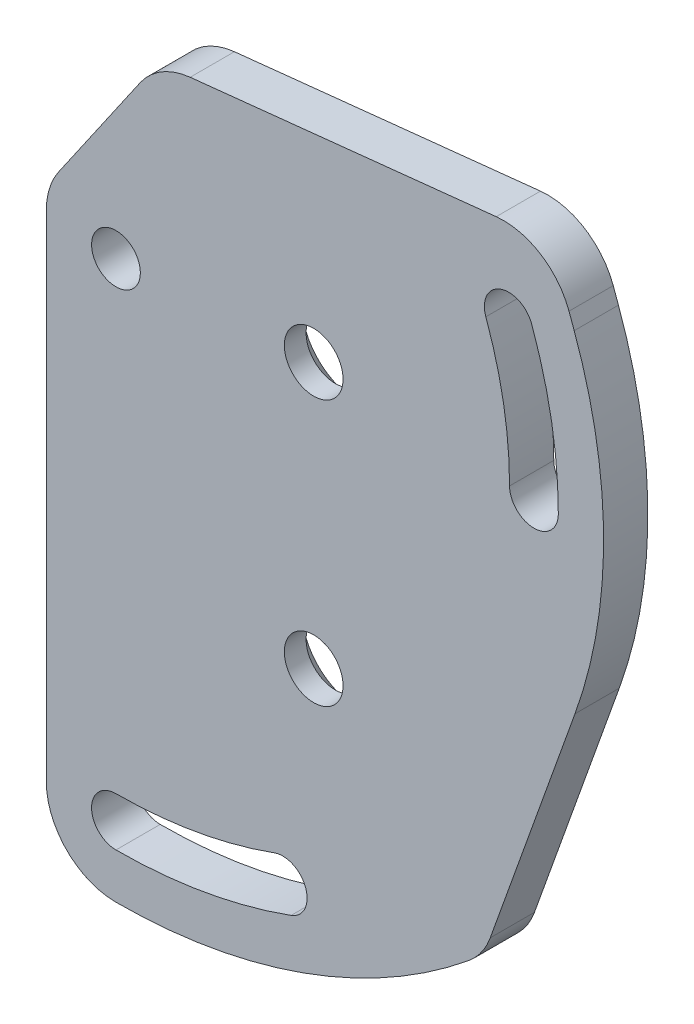
ISO-10303-21;
HEADER;
FILE_DESCRIPTION(('STEP AP214'),'2;1');
FILE_NAME('part.step','',(''),(''),'','','');
FILE_SCHEMA(('AUTOMOTIVE_DESIGN { 1 0 10303 214 1 1 1 1 }'));
ENDSEC;
DATA;
#1=APPLICATION_CONTEXT('core data for automotive mechanical design processes');
#2=APPLICATION_PROTOCOL_DEFINITION('international standard','automotive_design',2000,#1);
#3=PRODUCT_CONTEXT('',#1,'mechanical');
#4=PRODUCT('Part','Part','',(#3));
#5=PRODUCT_RELATED_PRODUCT_CATEGORY('part','',(#4));
#6=PRODUCT_DEFINITION_FORMATION('','',#4);
#7=PRODUCT_DEFINITION_CONTEXT('part definition',#1,'design');
#8=PRODUCT_DEFINITION('design','',#6,#7);
#9=PRODUCT_DEFINITION_SHAPE('','',#8);
#10=(LENGTH_UNIT() NAMED_UNIT(*) SI_UNIT(.MILLI.,.METRE.));
#11=(NAMED_UNIT(*) PLANE_ANGLE_UNIT() SI_UNIT($,.RADIAN.));
#12=(NAMED_UNIT(*) SI_UNIT($,.STERADIAN.) SOLID_ANGLE_UNIT());
#13=UNCERTAINTY_MEASURE_WITH_UNIT(LENGTH_MEASURE(1.E-05),#10,'distance_accuracy_value','');
#14=(GEOMETRIC_REPRESENTATION_CONTEXT(3) GLOBAL_UNCERTAINTY_ASSIGNED_CONTEXT((#13)) GLOBAL_UNIT_ASSIGNED_CONTEXT((#10,
#11,#12)) REPRESENTATION_CONTEXT('',''));
#15=CARTESIAN_POINT('',(0.,0.,0.));
#16=DIRECTION('',(0.,0.,1.));
#17=DIRECTION('',(1.,0.,0.));
#18=AXIS2_PLACEMENT_3D('',#15,#16,#17);
#19=CARTESIAN_POINT('',(-9.99999999999999,-10.,6.35));
#20=DIRECTION('',(1.,0.,0.));
#21=DIRECTION('',(0.,1.,0.));
#22=AXIS2_PLACEMENT_3D('',#19,#20,#21);
#23=PLANE('',#22);
#24=DIRECTION('',(0.,-1.,0.));
#25=VECTOR('',#24,1.);
#26=CARTESIAN_POINT('',(-9.99999999999999,-10.,0.));
#27=LINE('',#26,#25);
#28=CARTESIAN_POINT('',(-9.99999999999999,70.9938592312825,0.));
#29=VERTEX_POINT('',#28);
#30=CARTESIAN_POINT('',(-9.99999999999999,0.,0.));
#31=VERTEX_POINT('',#30);
#32=EDGE_CURVE('E313',#29,#31,#27,.T.);
#33=ORIENTED_EDGE('',*,*,#32,.T.);
#34=DIRECTION('',(0.,0.,-1.));
#35=VECTOR('',#34,1.);
#36=CARTESIAN_POINT('',(-9.99999999999999,0.,6.35));
#37=LINE('',#36,#35);
#38=CARTESIAN_POINT('',(-9.99999999999999,0.,6.35));
#39=VERTEX_POINT('',#38);
#40=EDGE_CURVE('E89',#31,#39,#37,.F.);
#41=ORIENTED_EDGE('',*,*,#40,.T.);
#42=DIRECTION('',(0.,-1.,0.));
#43=VECTOR('',#42,1.);
#44=CARTESIAN_POINT('',(-9.99999999999999,-10.,6.35));
#45=LINE('',#44,#43);
#46=CARTESIAN_POINT('',(-9.99999999999999,70.9938592312825,6.35));
#47=VERTEX_POINT('',#46);
#48=EDGE_CURVE('E216',#47,#39,#45,.T.);
#49=ORIENTED_EDGE('',*,*,#48,.F.);
#50=DIRECTION('',(0.,0.,-1.));
#51=VECTOR('',#50,1.);
#52=CARTESIAN_POINT('',(-9.99999999999999,70.9938592312825,0.));
#53=LINE('',#52,#51);
#54=EDGE_CURVE('E337',#47,#29,#53,.T.);
#55=ORIENTED_EDGE('',*,*,#54,.T.);
#56=EDGE_LOOP('',(#33,#41,#49,#55));
#57=FACE_BOUND('',#56,.T.);
#58=ADVANCED_FACE('F74',(#57),#23,.F.);
#59=CARTESIAN_POINT('',(62.3582820217571,103.338336240656,6.35));
#60=DIRECTION('',(-0.93969262078591,-0.342020143325664,0.));
#61=DIRECTION('',(0.342020143325664,-0.93969262078591,0.));
#62=AXIS2_PLACEMENT_3D('',#59,#60,#61);
#63=PLANE('',#62);
#64=DIRECTION('',(-0.342020143325664,0.93969262078591,0.));
#65=VECTOR('',#64,1.);
#66=CARTESIAN_POINT('',(62.3582820217571,103.338336240656,0.));
#67=LINE('',#66,#65);
#68=CARTESIAN_POINT('',(65.7784834550137,93.9414100327965,0.));
#69=VERTEX_POINT('',#68);
#70=CARTESIAN_POINT('',(65.0315789139986,95.9935133937235,0.));
#71=VERTEX_POINT('',#70);
#72=EDGE_CURVE('E309',#69,#71,#67,.T.);
#73=ORIENTED_EDGE('',*,*,#72,.T.);
#74=DIRECTION('',(0.,0.,-1.));
#75=VECTOR('',#74,1.);
#76=CARTESIAN_POINT('',(65.0315789139986,95.9935133937235,6.35));
#77=LINE('',#76,#75);
#78=CARTESIAN_POINT('',(65.0315789139986,95.9935133937235,6.35));
#79=VERTEX_POINT('',#78);
#80=EDGE_CURVE('E13',#71,#79,#77,.F.);
#81=ORIENTED_EDGE('',*,*,#80,.T.);
#82=DIRECTION('',(-0.342020143325664,0.93969262078591,0.));
#83=VECTOR('',#82,1.);
#84=CARTESIAN_POINT('',(62.3582820217571,103.338336240656,6.35));
#85=LINE('',#84,#83);
#86=CARTESIAN_POINT('',(65.7784834550137,93.9414100327965,6.35));
#87=VERTEX_POINT('',#86);
#88=EDGE_CURVE('E310',#87,#79,#85,.T.);
#89=ORIENTED_EDGE('',*,*,#88,.F.);
#90=DIRECTION('',(0.,0.,-1.));
#91=VECTOR('',#90,1.);
#92=CARTESIAN_POINT('',(65.7784834550137,93.9414100327965,6.35));
#93=LINE('',#92,#91);
#94=EDGE_CURVE('E241',#87,#69,#93,.T.);
#95=ORIENTED_EDGE('',*,*,#94,.T.);
#96=EDGE_LOOP('',(#73,#81,#89,#95));
#97=FACE_BOUND('',#96,.T.);
#98=ADVANCED_FACE('F440',(#97),#63,.F.);
#99=CARTESIAN_POINT('',(0.,70.,6.35));
#100=DIRECTION('',(0.,0.,-1.));
#101=DIRECTION('',(-1.,0.,0.));
#102=AXIS2_PLACEMENT_3D('',#99,#100,#101);
#103=PLANE('',#102);
#104=CARTESIAN_POINT('',(28.3849753948783,71.3157147525113,6.35));
#105=DIRECTION('',(0.,0.,-1.));
#106=DIRECTION('',(-1.,0.,0.));
#107=AXIS2_PLACEMENT_3D('',#104,#105,#106);
#108=CIRCLE('',#107,4.21639999999999);
#109=CARTESIAN_POINT('',(24.1685753948783,71.3157147525113,6.35));
#110=VERTEX_POINT('',#109);
#111=EDGE_CURVE('E406',#110,#110,#108,.T.);
#112=ORIENTED_EDGE('',*,*,#111,.T.);
#113=EDGE_LOOP('',(#112));
#114=FACE_BOUND('',#113,.T.);
#115=CARTESIAN_POINT('',(28.3849753948783,33.2157147525113,6.35));
#116=DIRECTION('',(0.,0.,-1.));
#117=DIRECTION('',(-1.,0.,0.));
#118=AXIS2_PLACEMENT_3D('',#115,#116,#117);
#119=CIRCLE('',#118,4.21639999999999);
#120=CARTESIAN_POINT('',(24.1685753948783,33.2157147525113,6.35));
#121=VERTEX_POINT('',#120);
#122=EDGE_CURVE('E386',#121,#121,#119,.T.);
#123=ORIENTED_EDGE('',*,*,#122,.T.);
#124=EDGE_LOOP('',(#123));
#125=FACE_BOUND('',#124,.T.);
#126=CARTESIAN_POINT('',(0.,70.,6.35));
#127=DIRECTION('',(0.,0.,1.));
#128=DIRECTION('',(1.,0.,0.));
#129=AXIS2_PLACEMENT_3D('',#126,#127,#128);
#130=CIRCLE('',#129,3.5);
#131=CARTESIAN_POINT('',(3.5,70.,6.35));
#132=VERTEX_POINT('',#131);
#133=EDGE_CURVE('E238',#132,#132,#130,.T.);
#134=ORIENTED_EDGE('',*,*,#133,.F.);
#135=EDGE_LOOP('',(#134));
#136=FACE_BOUND('',#135,.T.);
#137=CARTESIAN_POINT('',(23.9414100327964,4.22151654498627,6.35));
#138=DIRECTION('',(0.,0.,1.));
#139=DIRECTION('',(-1.,0.,0.));
#140=AXIS2_PLACEMENT_3D('',#137,#138,#139);
#141=CIRCLE('',#140,3.5);
#142=CARTESIAN_POINT('',(25.1384805344363,0.932592372235586,6.35));
#143=VERTEX_POINT('',#142);
#144=CARTESIAN_POINT('',(22.7443395311566,7.51044071773697,6.35));
#145=VERTEX_POINT('',#144);
#146=EDGE_CURVE('E245',#143,#145,#141,.T.);
#147=ORIENTED_EDGE('',*,*,#146,.F.);
#148=CARTESIAN_POINT('',(0.,70.,6.35));
#149=DIRECTION('',(0.,0.,1.));
#150=DIRECTION('',(-1.,0.,0.));
#151=AXIS2_PLACEMENT_3D('',#148,#149,#150);
#152=CIRCLE('',#151,73.5);
#153=CARTESIAN_POINT('',(0.,-3.5,6.35));
#154=VERTEX_POINT('',#153);
#155=EDGE_CURVE('E253',#154,#143,#152,.T.);
#156=ORIENTED_EDGE('',*,*,#155,.F.);
#157=CARTESIAN_POINT('',(0.,0.,6.35));
#158=DIRECTION('',(0.,0.,1.));
#159=DIRECTION('',(1.,0.,0.));
#160=AXIS2_PLACEMENT_3D('',#157,#158,#159);
#161=CIRCLE('',#160,3.5);
#162=CARTESIAN_POINT('',(0.,3.5,6.35));
#163=VERTEX_POINT('',#162);
#164=EDGE_CURVE('E250',#163,#154,#161,.T.);
#165=ORIENTED_EDGE('',*,*,#164,.F.);
#166=CARTESIAN_POINT('',(0.,70.,6.35));
#167=DIRECTION('',(0.,0.,-1.));
#168=DIRECTION('',(-1.,0.,0.));
#169=AXIS2_PLACEMENT_3D('',#166,#167,#168);
#170=CIRCLE('',#169,66.5);
#171=EDGE_CURVE('E247',#145,#163,#170,.T.);
#172=ORIENTED_EDGE('',*,*,#171,.F.);
#173=EDGE_LOOP('',(#147,#156,#165,#172));
#174=FACE_BOUND('',#173,.T.);
#175=CARTESIAN_POINT('',(56.3815572471546,90.5212085995398,6.35));
#176=DIRECTION('',(0.,0.,1.));
#177=DIRECTION('',(-1.,0.,0.));
#178=AXIS2_PLACEMENT_3D('',#175,#176,#177);
#179=CIRCLE('',#178,3.5);
#180=CARTESIAN_POINT('',(59.6704814199053,91.7182791011796,6.35));
#181=VERTEX_POINT('',#180);
#182=CARTESIAN_POINT('',(53.0926330744039,89.3241380979,6.35));
#183=VERTEX_POINT('',#182);
#184=EDGE_CURVE('E279',#181,#183,#179,.T.);
#185=ORIENTED_EDGE('',*,*,#184,.F.);
#186=CARTESIAN_POINT('',(0.,70.,6.35));
#187=DIRECTION('',(0.,0.,1.));
#188=DIRECTION('',(-1.,0.,0.));
#189=AXIS2_PLACEMENT_3D('',#186,#187,#188);
#190=CIRCLE('',#189,63.5);
#191=CARTESIAN_POINT('',(63.5,70.,6.35));
#192=VERTEX_POINT('',#191);
#193=EDGE_CURVE('E287',#192,#181,#190,.T.);
#194=ORIENTED_EDGE('',*,*,#193,.F.);
#195=CARTESIAN_POINT('',(60.,70.,6.35));
#196=DIRECTION('',(0.,0.,1.));
#197=DIRECTION('',(1.,0.,0.));
#198=AXIS2_PLACEMENT_3D('',#195,#196,#197);
#199=CIRCLE('',#198,3.5);
#200=CARTESIAN_POINT('',(56.5,70.,6.35));
#201=VERTEX_POINT('',#200);
#202=EDGE_CURVE('E284',#201,#192,#199,.T.);
#203=ORIENTED_EDGE('',*,*,#202,.F.);
#204=CARTESIAN_POINT('',(0.,70.,6.35));
#205=DIRECTION('',(0.,0.,-1.));
#206=DIRECTION('',(-1.,0.,0.));
#207=AXIS2_PLACEMENT_3D('',#204,#205,#206);
#208=CIRCLE('',#207,56.5);
#209=EDGE_CURVE('E281',#183,#201,#208,.T.);
#210=ORIENTED_EDGE('',*,*,#209,.F.);
#211=EDGE_LOOP('',(#185,#194,#203,#210));
#212=FACE_BOUND('',#211,.T.);
#213=CARTESIAN_POINT('',(0.,70.,6.35));
#214=DIRECTION('',(0.,0.,1.));
#215=DIRECTION('',(1.,0.,0.));
#216=AXIS2_PLACEMENT_3D('',#213,#214,#215);
#217=CIRCLE('',#216,80.);
#218=CARTESIAN_POINT('',(0.,-10.,6.35));
#219=VERTEX_POINT('',#218);
#220=CARTESIAN_POINT('',(50.6414956905734,8.0690794980275,6.35));
#221=VERTEX_POINT('',#220);
#222=EDGE_CURVE('E214',#219,#221,#217,.T.);
#223=ORIENTED_EDGE('',*,*,#222,.T.);
#224=CARTESIAN_POINT('',(44.3113087292517,15.8104445607741,6.35));
#225=DIRECTION('',(0.,0.,-1.));
#226=DIRECTION('',(-1.,0.,0.));
#227=AXIS2_PLACEMENT_3D('',#224,#225,#226);
#228=CIRCLE('',#227,10.);
#229=CARTESIAN_POINT('',(53.7245959355015,12.4355336030369,6.35));
#230=VERTEX_POINT('',#229);
#231=EDGE_CURVE('E219',#221,#230,#228,.F.);
#232=ORIENTED_EDGE('',*,*,#231,.T.);
#233=DIRECTION('',(-0.33749109577372,-0.941328720624976,0.));
#234=VECTOR('',#233,1.);
#235=CARTESIAN_POINT('',(43.6547061452585,-15.6513599233022,6.35));
#236=LINE('',#235,#234);
#237=CARTESIAN_POINT('',(65.8930104437483,46.3756232958396,6.35));
#238=VERTEX_POINT('',#237);
#239=EDGE_CURVE('E229',#238,#230,#236,.T.);
#240=ORIENTED_EDGE('',*,*,#239,.F.);
#241=CARTESIAN_POINT('',(0.,70.,6.35));
#242=DIRECTION('',(0.,0.,1.));
#243=DIRECTION('',(1.,0.,0.));
#244=AXIS2_PLACEMENT_3D('',#241,#242,#243);
#245=CIRCLE('',#244,70.);
#246=EDGE_CURVE('E381',#87,#238,#245,.F.);
#247=ORIENTED_EDGE('',*,*,#246,.F.);
#248=ORIENTED_EDGE('',*,*,#88,.T.);
#249=CARTESIAN_POINT('',(55.6346527061395,92.5733119604669,6.35));
#250=DIRECTION('',(0.,0.,-1.));
#251=DIRECTION('',(-1.,0.,0.));
#252=AXIS2_PLACEMENT_3D('',#249,#250,#251);
#253=CIRCLE('',#252,10.);
#254=CARTESIAN_POINT('',(54.5852423613677,102.518096419081,6.35));
#255=VERTEX_POINT('',#254);
#256=EDGE_CURVE('E333',#79,#255,#253,.F.);
#257=ORIENTED_EDGE('',*,*,#256,.T.);
#258=DIRECTION('',(-0.994478445861377,-0.104941034477181,0.));
#259=VECTOR('',#258,1.);
#260=CARTESIAN_POINT('',(-10.0978256798941,95.69250044799,6.35));
#261=LINE('',#260,#259);
#262=CARTESIAN_POINT('',(10.6527960975872,97.8821826119785,6.35));
#263=VERTEX_POINT('',#262);
#264=EDGE_CURVE('E357',#255,#263,#261,.T.);
#265=ORIENTED_EDGE('',*,*,#264,.T.);
#266=CARTESIAN_POINT('',(11.702206442359,87.9373981533647,6.35));
#267=DIRECTION('',(0.,0.,-1.));
#268=DIRECTION('',(-1.,0.,0.));
#269=AXIS2_PLACEMENT_3D('',#266,#267,#268);
#270=CIRCLE('',#269,10.);
#271=CARTESIAN_POINT('',(3.47394053532746,93.6203234707679,6.35));
#272=VERTEX_POINT('',#271);
#273=EDGE_CURVE('E331',#263,#272,#270,.F.);
#274=ORIENTED_EDGE('',*,*,#273,.T.);
#275=DIRECTION('',(0.568292531740321,0.822826590703155,0.));
#276=VECTOR('',#275,1.);
#277=CARTESIAN_POINT('',(-41.4254351008577,28.6108466326944,6.35));
#278=LINE('',#277,#276);
#279=CARTESIAN_POINT('',(-8.22826590703155,76.6767845486857,6.35));
#280=VERTEX_POINT('',#279);
#281=EDGE_CURVE('E374',#280,#272,#278,.T.);
#282=ORIENTED_EDGE('',*,*,#281,.F.);
#283=CARTESIAN_POINT('',(0.,70.9938592312825,6.35));
#284=DIRECTION('',(0.,0.,-1.));
#285=DIRECTION('',(-1.,0.,0.));
#286=AXIS2_PLACEMENT_3D('',#283,#284,#285);
#287=CIRCLE('',#286,10.);
#288=EDGE_CURVE('E96',#280,#47,#287,.F.);
#289=ORIENTED_EDGE('',*,*,#288,.T.);
#290=ORIENTED_EDGE('',*,*,#48,.T.);
#291=CARTESIAN_POINT('',(0.,0.,6.35));
#292=DIRECTION('',(0.,0.,-1.));
#293=DIRECTION('',(-1.,0.,0.));
#294=AXIS2_PLACEMENT_3D('',#291,#292,#293);
#295=CIRCLE('',#294,10.);
#296=EDGE_CURVE('E211',#39,#219,#295,.F.);
#297=ORIENTED_EDGE('',*,*,#296,.T.);
#298=EDGE_LOOP('',(#223,#232,#240,#247,#248,#257,#265,#274,#282,#289,#290,#297));
#299=FACE_BOUND('',#298,.T.);
#300=ADVANCED_FACE('F213',(#114,#125,#136,#174,#212,#299),#103,.F.);
#301=CARTESIAN_POINT('',(0.,70.,0.));
#302=DIRECTION('',(0.,0.,-1.));
#303=DIRECTION('',(-1.,0.,0.));
#304=AXIS2_PLACEMENT_3D('',#301,#302,#303);
#305=PLANE('',#304);
#306=CARTESIAN_POINT('',(28.3849753948783,71.3157147525113,0.));
#307=DIRECTION('',(0.,0.,-1.));
#308=DIRECTION('',(-1.,0.,0.));
#309=AXIS2_PLACEMENT_3D('',#306,#307,#308);
#310=CIRCLE('',#309,8.0645);
#311=CARTESIAN_POINT('',(20.3204753948783,71.3157147525113,0.));
#312=VERTEX_POINT('',#311);
#313=EDGE_CURVE('E412',#312,#312,#310,.T.);
#314=ORIENTED_EDGE('',*,*,#313,.F.);
#315=EDGE_LOOP('',(#314));
#316=FACE_BOUND('',#315,.T.);
#317=CARTESIAN_POINT('',(28.3849753948783,33.2157147525113,0.));
#318=DIRECTION('',(0.,0.,-1.));
#319=DIRECTION('',(-1.,0.,0.));
#320=AXIS2_PLACEMENT_3D('',#317,#318,#319);
#321=CIRCLE('',#320,8.0645);
#322=CARTESIAN_POINT('',(20.3204753948783,33.2157147525113,0.));
#323=VERTEX_POINT('',#322);
#324=EDGE_CURVE('E403',#323,#323,#321,.T.);
#325=ORIENTED_EDGE('',*,*,#324,.F.);
#326=EDGE_LOOP('',(#325));
#327=FACE_BOUND('',#326,.T.);
#328=DIRECTION('',(-0.33749109577372,-0.941328720624976,0.));
#329=VECTOR('',#328,1.);
#330=CARTESIAN_POINT('',(43.6547061452585,-15.6513599233022,0.));
#331=LINE('',#330,#329);
#332=CARTESIAN_POINT('',(65.8930104437483,46.3756232958396,0.));
#333=VERTEX_POINT('',#332);
#334=CARTESIAN_POINT('',(53.7245959355015,12.4355336030369,0.));
#335=VERTEX_POINT('',#334);
#336=EDGE_CURVE('E370',#333,#335,#331,.T.);
#337=ORIENTED_EDGE('',*,*,#336,.T.);
#338=CARTESIAN_POINT('',(44.3113087292517,15.8104445607741,0.));
#339=DIRECTION('',(0.,0.,-1.));
#340=DIRECTION('',(-1.,0.,0.));
#341=AXIS2_PLACEMENT_3D('',#338,#339,#340);
#342=CIRCLE('',#341,10.);
#343=CARTESIAN_POINT('',(50.6414956905734,8.0690794980275,0.));
#344=VERTEX_POINT('',#343);
#345=EDGE_CURVE('E328',#335,#344,#342,.T.);
#346=ORIENTED_EDGE('',*,*,#345,.T.);
#347=CARTESIAN_POINT('',(0.,70.,0.));
#348=DIRECTION('',(0.,0.,1.));
#349=DIRECTION('',(1.,0.,0.));
#350=AXIS2_PLACEMENT_3D('',#347,#348,#349);
#351=CIRCLE('',#350,80.);
#352=CARTESIAN_POINT('',(0.,-10.,0.));
#353=VERTEX_POINT('',#352);
#354=EDGE_CURVE('E385',#353,#344,#351,.T.);
#355=ORIENTED_EDGE('',*,*,#354,.F.);
#356=CARTESIAN_POINT('',(0.,0.,0.));
#357=DIRECTION('',(0.,0.,-1.));
#358=DIRECTION('',(-1.,0.,0.));
#359=AXIS2_PLACEMENT_3D('',#356,#357,#358);
#360=CIRCLE('',#359,10.);
#361=EDGE_CURVE('E233',#353,#31,#360,.T.);
#362=ORIENTED_EDGE('',*,*,#361,.T.);
#363=ORIENTED_EDGE('',*,*,#32,.F.);
#364=CARTESIAN_POINT('',(0.,70.9938592312825,0.));
#365=DIRECTION('',(0.,0.,-1.));
#366=DIRECTION('',(-1.,0.,0.));
#367=AXIS2_PLACEMENT_3D('',#364,#365,#366);
#368=CIRCLE('',#367,10.);
#369=CARTESIAN_POINT('',(-8.22826590703155,76.6767845486857,0.));
#370=VERTEX_POINT('',#369);
#371=EDGE_CURVE('E325',#29,#370,#368,.T.);
#372=ORIENTED_EDGE('',*,*,#371,.T.);
#373=DIRECTION('',(0.568292531740321,0.822826590703155,0.));
#374=VECTOR('',#373,1.);
#375=CARTESIAN_POINT('',(-41.4254351008577,28.6108466326944,0.));
#376=LINE('',#375,#374);
#377=CARTESIAN_POINT('',(3.47394053532746,93.6203234707679,0.));
#378=VERTEX_POINT('',#377);
#379=EDGE_CURVE('E230',#370,#378,#376,.T.);
#380=ORIENTED_EDGE('',*,*,#379,.T.);
#381=CARTESIAN_POINT('',(11.702206442359,87.9373981533647,0.));
#382=DIRECTION('',(0.,0.,-1.));
#383=DIRECTION('',(-1.,0.,0.));
#384=AXIS2_PLACEMENT_3D('',#381,#382,#383);
#385=CIRCLE('',#384,10.);
#386=CARTESIAN_POINT('',(10.6527960975872,97.8821826119785,0.));
#387=VERTEX_POINT('',#386);
#388=EDGE_CURVE('E321',#378,#387,#385,.T.);
#389=ORIENTED_EDGE('',*,*,#388,.T.);
#390=DIRECTION('',(-0.994478445861377,-0.104941034477181,0.));
#391=VECTOR('',#390,1.);
#392=CARTESIAN_POINT('',(-10.0978256798941,95.69250044799,0.));
#393=LINE('',#392,#391);
#394=CARTESIAN_POINT('',(54.5852423613677,102.518096419081,0.));
#395=VERTEX_POINT('',#394);
#396=EDGE_CURVE('E354',#395,#387,#393,.T.);
#397=ORIENTED_EDGE('',*,*,#396,.F.);
#398=CARTESIAN_POINT('',(55.6346527061395,92.5733119604669,0.));
#399=DIRECTION('',(0.,0.,-1.));
#400=DIRECTION('',(-1.,0.,0.));
#401=AXIS2_PLACEMENT_3D('',#398,#399,#400);
#402=CIRCLE('',#401,10.);
#403=EDGE_CURVE('E323',#395,#71,#402,.T.);
#404=ORIENTED_EDGE('',*,*,#403,.T.);
#405=ORIENTED_EDGE('',*,*,#72,.F.);
#406=CARTESIAN_POINT('',(0.,70.,0.));
#407=DIRECTION('',(0.,0.,1.));
#408=DIRECTION('',(1.,0.,0.));
#409=AXIS2_PLACEMENT_3D('',#406,#407,#408);
#410=CIRCLE('',#409,70.);
#411=EDGE_CURVE('E366',#69,#333,#410,.F.);
#412=ORIENTED_EDGE('',*,*,#411,.T.);
#413=EDGE_LOOP('',(#337,#346,#355,#362,#363,#372,#380,#389,#397,#404,#405,#412));
#414=FACE_BOUND('',#413,.T.);
#415=CARTESIAN_POINT('',(0.,70.,0.));
#416=DIRECTION('',(0.,0.,1.));
#417=DIRECTION('',(1.,0.,0.));
#418=AXIS2_PLACEMENT_3D('',#415,#416,#417);
#419=CIRCLE('',#418,3.5);
#420=CARTESIAN_POINT('',(3.5,70.,0.));
#421=VERTEX_POINT('',#420);
#422=EDGE_CURVE('E234',#421,#421,#419,.T.);
#423=ORIENTED_EDGE('',*,*,#422,.T.);
#424=EDGE_LOOP('',(#423));
#425=FACE_BOUND('',#424,.T.);
#426=CARTESIAN_POINT('',(0.,70.,0.));
#427=DIRECTION('',(0.,0.,1.));
#428=DIRECTION('',(-1.,0.,0.));
#429=AXIS2_PLACEMENT_3D('',#426,#427,#428);
#430=CIRCLE('',#429,73.5);
#431=CARTESIAN_POINT('',(0.,-3.5,0.));
#432=VERTEX_POINT('',#431);
#433=CARTESIAN_POINT('',(25.1384805344363,0.932592372235586,0.));
#434=VERTEX_POINT('',#433);
#435=EDGE_CURVE('E248',#432,#434,#430,.T.);
#436=ORIENTED_EDGE('',*,*,#435,.T.);
#437=CARTESIAN_POINT('',(23.9414100327964,4.22151654498627,0.));
#438=DIRECTION('',(0.,0.,1.));
#439=DIRECTION('',(-1.,0.,0.));
#440=AXIS2_PLACEMENT_3D('',#437,#438,#439);
#441=CIRCLE('',#440,3.5);
#442=CARTESIAN_POINT('',(22.7443395311566,7.51044071773697,0.));
#443=VERTEX_POINT('',#442);
#444=EDGE_CURVE('E256',#434,#443,#441,.T.);
#445=ORIENTED_EDGE('',*,*,#444,.T.);
#446=CARTESIAN_POINT('',(0.,70.,0.));
#447=DIRECTION('',(0.,0.,-1.));
#448=DIRECTION('',(-1.,0.,0.));
#449=AXIS2_PLACEMENT_3D('',#446,#447,#448);
#450=CIRCLE('',#449,66.5);
#451=CARTESIAN_POINT('',(0.,3.5,0.));
#452=VERTEX_POINT('',#451);
#453=EDGE_CURVE('E259',#443,#452,#450,.T.);
#454=ORIENTED_EDGE('',*,*,#453,.T.);
#455=CARTESIAN_POINT('',(0.,0.,0.));
#456=DIRECTION('',(0.,0.,1.));
#457=DIRECTION('',(1.,0.,0.));
#458=AXIS2_PLACEMENT_3D('',#455,#456,#457);
#459=CIRCLE('',#458,3.5);
#460=EDGE_CURVE('E262',#452,#432,#459,.T.);
#461=ORIENTED_EDGE('',*,*,#460,.T.);
#462=EDGE_LOOP('',(#436,#445,#454,#461));
#463=FACE_BOUND('',#462,.T.);
#464=CARTESIAN_POINT('',(0.,70.,0.));
#465=DIRECTION('',(0.,0.,1.));
#466=DIRECTION('',(-1.,0.,0.));
#467=AXIS2_PLACEMENT_3D('',#464,#465,#466);
#468=CIRCLE('',#467,63.5);
#469=CARTESIAN_POINT('',(63.5,70.,0.));
#470=VERTEX_POINT('',#469);
#471=CARTESIAN_POINT('',(59.6704814199053,91.7182791011796,0.));
#472=VERTEX_POINT('',#471);
#473=EDGE_CURVE('E282',#470,#472,#468,.T.);
#474=ORIENTED_EDGE('',*,*,#473,.T.);
#475=CARTESIAN_POINT('',(56.3815572471546,90.5212085995398,0.));
#476=DIRECTION('',(0.,0.,1.));
#477=DIRECTION('',(-1.,0.,0.));
#478=AXIS2_PLACEMENT_3D('',#475,#476,#477);
#479=CIRCLE('',#478,3.5);
#480=CARTESIAN_POINT('',(53.0926330744039,89.3241380979,0.));
#481=VERTEX_POINT('',#480);
#482=EDGE_CURVE('E276',#472,#481,#479,.T.);
#483=ORIENTED_EDGE('',*,*,#482,.T.);
#484=CARTESIAN_POINT('',(0.,70.,0.));
#485=DIRECTION('',(0.,0.,-1.));
#486=DIRECTION('',(-1.,0.,0.));
#487=AXIS2_PLACEMENT_3D('',#484,#485,#486);
#488=CIRCLE('',#487,56.5);
#489=CARTESIAN_POINT('',(56.5,70.,0.));
#490=VERTEX_POINT('',#489);
#491=EDGE_CURVE('E292',#481,#490,#488,.T.);
#492=ORIENTED_EDGE('',*,*,#491,.T.);
#493=CARTESIAN_POINT('',(60.,70.,0.));
#494=DIRECTION('',(0.,0.,1.));
#495=DIRECTION('',(1.,0.,0.));
#496=AXIS2_PLACEMENT_3D('',#493,#494,#495);
#497=CIRCLE('',#496,3.5);
#498=EDGE_CURVE('E295',#490,#470,#497,.T.);
#499=ORIENTED_EDGE('',*,*,#498,.T.);
#500=EDGE_LOOP('',(#474,#483,#492,#499));
#501=FACE_BOUND('',#500,.T.);
#502=ADVANCED_FACE('F362',(#316,#327,#414,#425,#463,#501),#305,.T.);
#503=CARTESIAN_POINT('',(56.3815572471546,90.5212085995398,6.35));
#504=DIRECTION('',(0.,0.,-1.));
#505=DIRECTION('',(-1.,0.,0.));
#506=AXIS2_PLACEMENT_3D('',#503,#504,#505);
#507=CYLINDRICAL_SURFACE('',#506,3.5);
#508=ORIENTED_EDGE('',*,*,#482,.F.);
#509=DIRECTION('',(0.,0.,-1.));
#510=VECTOR('',#509,1.);
#511=CARTESIAN_POINT('',(59.6704814199053,91.7182791011796,6.35));
#512=LINE('',#511,#510);
#513=EDGE_CURVE('E289',#181,#472,#512,.T.);
#514=ORIENTED_EDGE('',*,*,#513,.F.);
#515=ORIENTED_EDGE('',*,*,#184,.T.);
#516=DIRECTION('',(0.,0.,-1.));
#517=VECTOR('',#516,1.);
#518=CARTESIAN_POINT('',(53.0926330744039,89.3241380979,6.35));
#519=LINE('',#518,#517);
#520=EDGE_CURVE('E306',#183,#481,#519,.T.);
#521=ORIENTED_EDGE('',*,*,#520,.T.);
#522=EDGE_LOOP('',(#508,#514,#515,#521));
#523=FACE_BOUND('',#522,.T.);
#524=ADVANCED_FACE('F420',(#523),#507,.F.);
#525=CARTESIAN_POINT('',(0.,70.,6.35));
#526=DIRECTION('',(0.,0.,-1.));
#527=DIRECTION('',(-1.,0.,0.));
#528=AXIS2_PLACEMENT_3D('',#525,#526,#527);
#529=CYLINDRICAL_SURFACE('',#528,56.5);
#530=ORIENTED_EDGE('',*,*,#491,.F.);
#531=ORIENTED_EDGE('',*,*,#520,.F.);
#532=ORIENTED_EDGE('',*,*,#209,.T.);
#533=DIRECTION('',(0.,0.,-1.));
#534=VECTOR('',#533,1.);
#535=CARTESIAN_POINT('',(56.5,70.,6.35));
#536=LINE('',#535,#534);
#537=EDGE_CURVE('E304',#201,#490,#536,.T.);
#538=ORIENTED_EDGE('',*,*,#537,.T.);
#539=EDGE_LOOP('',(#530,#531,#532,#538));
#540=FACE_BOUND('',#539,.T.);
#541=ADVANCED_FACE('F510',(#540),#529,.T.);
#542=CARTESIAN_POINT('',(60.,70.,6.35));
#543=DIRECTION('',(0.,0.,-1.));
#544=DIRECTION('',(-1.,0.,0.));
#545=AXIS2_PLACEMENT_3D('',#542,#543,#544);
#546=CYLINDRICAL_SURFACE('',#545,3.5);
#547=ORIENTED_EDGE('',*,*,#498,.F.);
#548=ORIENTED_EDGE('',*,*,#537,.F.);
#549=ORIENTED_EDGE('',*,*,#202,.T.);
#550=DIRECTION('',(0.,0.,-1.));
#551=VECTOR('',#550,1.);
#552=CARTESIAN_POINT('',(63.5,70.,6.35));
#553=LINE('',#552,#551);
#554=EDGE_CURVE('E302',#192,#470,#553,.T.);
#555=ORIENTED_EDGE('',*,*,#554,.T.);
#556=EDGE_LOOP('',(#547,#548,#549,#555));
#557=FACE_BOUND('',#556,.T.);
#558=ADVANCED_FACE('F506',(#557),#546,.F.);
#559=CARTESIAN_POINT('',(0.,70.,6.35));
#560=DIRECTION('',(0.,0.,-1.));
#561=DIRECTION('',(-1.,0.,0.));
#562=AXIS2_PLACEMENT_3D('',#559,#560,#561);
#563=CYLINDRICAL_SURFACE('',#562,63.5);
#564=ORIENTED_EDGE('',*,*,#473,.F.);
#565=ORIENTED_EDGE('',*,*,#554,.F.);
#566=ORIENTED_EDGE('',*,*,#193,.T.);
#567=ORIENTED_EDGE('',*,*,#513,.T.);
#568=EDGE_LOOP('',(#564,#565,#566,#567));
#569=FACE_BOUND('',#568,.T.);
#570=ADVANCED_FACE('F501',(#569),#563,.F.);
#571=CARTESIAN_POINT('',(23.9414100327964,4.22151654498627,6.35));
#572=DIRECTION('',(0.,0.,-1.));
#573=DIRECTION('',(-1.,0.,0.));
#574=AXIS2_PLACEMENT_3D('',#571,#572,#573);
#575=CYLINDRICAL_SURFACE('',#574,3.5);
#576=ORIENTED_EDGE('',*,*,#444,.F.);
#577=DIRECTION('',(0.,0.,-1.));
#578=VECTOR('',#577,1.);
#579=CARTESIAN_POINT('',(25.1384805344363,0.932592372235586,6.35));
#580=LINE('',#579,#578);
#581=EDGE_CURVE('E255',#143,#434,#580,.T.);
#582=ORIENTED_EDGE('',*,*,#581,.F.);
#583=ORIENTED_EDGE('',*,*,#146,.T.);
#584=DIRECTION('',(0.,0.,-1.));
#585=VECTOR('',#584,1.);
#586=CARTESIAN_POINT('',(22.7443395311566,7.51044071773697,6.35));
#587=LINE('',#586,#585);
#588=EDGE_CURVE('E273',#145,#443,#587,.T.);
#589=ORIENTED_EDGE('',*,*,#588,.T.);
#590=EDGE_LOOP('',(#576,#582,#583,#589));
#591=FACE_BOUND('',#590,.T.);
#592=ADVANCED_FACE('F498',(#591),#575,.F.);
#593=CARTESIAN_POINT('',(0.,70.,6.35));
#594=DIRECTION('',(0.,0.,-1.));
#595=DIRECTION('',(-1.,0.,0.));
#596=AXIS2_PLACEMENT_3D('',#593,#594,#595);
#597=CYLINDRICAL_SURFACE('',#596,66.5);
#598=ORIENTED_EDGE('',*,*,#453,.F.);
#599=ORIENTED_EDGE('',*,*,#588,.F.);
#600=ORIENTED_EDGE('',*,*,#171,.T.);
#601=DIRECTION('',(0.,0.,-1.));
#602=VECTOR('',#601,1.);
#603=CARTESIAN_POINT('',(0.,3.5,6.35));
#604=LINE('',#603,#602);
#605=EDGE_CURVE('E271',#163,#452,#604,.T.);
#606=ORIENTED_EDGE('',*,*,#605,.T.);
#607=EDGE_LOOP('',(#598,#599,#600,#606));
#608=FACE_BOUND('',#607,.T.);
#609=ADVANCED_FACE('F494',(#608),#597,.T.);
#610=CARTESIAN_POINT('',(0.,0.,6.35));
#611=DIRECTION('',(0.,0.,-1.));
#612=DIRECTION('',(-1.,0.,0.));
#613=AXIS2_PLACEMENT_3D('',#610,#611,#612);
#614=CYLINDRICAL_SURFACE('',#613,3.5);
#615=ORIENTED_EDGE('',*,*,#460,.F.);
#616=ORIENTED_EDGE('',*,*,#605,.F.);
#617=ORIENTED_EDGE('',*,*,#164,.T.);
#618=DIRECTION('',(0.,0.,-1.));
#619=VECTOR('',#618,1.);
#620=CARTESIAN_POINT('',(0.,-3.5,6.35));
#621=LINE('',#620,#619);
#622=EDGE_CURVE('E269',#154,#432,#621,.T.);
#623=ORIENTED_EDGE('',*,*,#622,.T.);
#624=EDGE_LOOP('',(#615,#616,#617,#623));
#625=FACE_BOUND('',#624,.T.);
#626=ADVANCED_FACE('F490',(#625),#614,.F.);
#627=CARTESIAN_POINT('',(0.,70.,6.35));
#628=DIRECTION('',(0.,0.,-1.));
#629=DIRECTION('',(-1.,0.,0.));
#630=AXIS2_PLACEMENT_3D('',#627,#628,#629);
#631=CYLINDRICAL_SURFACE('',#630,73.5);
#632=ORIENTED_EDGE('',*,*,#435,.F.);
#633=ORIENTED_EDGE('',*,*,#622,.F.);
#634=ORIENTED_EDGE('',*,*,#155,.T.);
#635=ORIENTED_EDGE('',*,*,#581,.T.);
#636=EDGE_LOOP('',(#632,#633,#634,#635));
#637=FACE_BOUND('',#636,.T.);
#638=ADVANCED_FACE('F478',(#637),#631,.F.);
#639=CARTESIAN_POINT('',(0.,70.,6.35));
#640=DIRECTION('',(0.,0.,-1.));
#641=DIRECTION('',(-1.,0.,0.));
#642=AXIS2_PLACEMENT_3D('',#639,#640,#641);
#643=CYLINDRICAL_SURFACE('',#642,3.5);
#644=ORIENTED_EDGE('',*,*,#133,.T.);
#645=EDGE_LOOP('',(#644));
#646=FACE_BOUND('',#645,.T.);
#647=ORIENTED_EDGE('',*,*,#422,.F.);
#648=EDGE_LOOP('',(#647));
#649=FACE_BOUND('',#648,.T.);
#650=ADVANCED_FACE('F471',(#646,#649),#643,.F.);
#651=CARTESIAN_POINT('',(-41.4254351008577,28.6108466326944,6.35));
#652=DIRECTION('',(-0.822826590703155,0.56829253174032,0.));
#653=DIRECTION('',(-0.56829253174032,-0.822826590703155,0.));
#654=AXIS2_PLACEMENT_3D('',#651,#652,#653);
#655=PLANE('',#654);
#656=ORIENTED_EDGE('',*,*,#379,.F.);
#657=DIRECTION('',(0.,0.,-1.));
#658=VECTOR('',#657,1.);
#659=CARTESIAN_POINT('',(-8.22826590703155,76.6767845486857,6.35));
#660=LINE('',#659,#658);
#661=EDGE_CURVE('E344',#370,#280,#660,.F.);
#662=ORIENTED_EDGE('',*,*,#661,.T.);
#663=ORIENTED_EDGE('',*,*,#281,.T.);
#664=DIRECTION('',(0.,0.,-1.));
#665=VECTOR('',#664,1.);
#666=CARTESIAN_POINT('',(3.47394053532745,93.6203234707679,0.));
#667=LINE('',#666,#665);
#668=EDGE_CURVE('E341',#272,#378,#667,.T.);
#669=ORIENTED_EDGE('',*,*,#668,.T.);
#670=EDGE_LOOP('',(#656,#662,#663,#669));
#671=FACE_BOUND('',#670,.T.);
#672=ADVANCED_FACE('F466',(#671),#655,.T.);
#673=CARTESIAN_POINT('',(-10.0978256798941,95.69250044799,6.35));
#674=DIRECTION('',(0.104941034477181,-0.994478445861377,0.));
#675=DIRECTION('',(0.994478445861377,0.104941034477181,0.));
#676=AXIS2_PLACEMENT_3D('',#673,#674,#675);
#677=PLANE('',#676);
#678=ORIENTED_EDGE('',*,*,#264,.F.);
#679=DIRECTION('',(0.,0.,-1.));
#680=VECTOR('',#679,1.);
#681=CARTESIAN_POINT('',(54.5852423613677,102.518096419081,6.35));
#682=LINE('',#681,#680);
#683=EDGE_CURVE('E82',#255,#395,#682,.T.);
#684=ORIENTED_EDGE('',*,*,#683,.T.);
#685=ORIENTED_EDGE('',*,*,#396,.T.);
#686=DIRECTION('',(0.,0.,-1.));
#687=VECTOR('',#686,1.);
#688=CARTESIAN_POINT('',(10.6527960975872,97.8821826119785,6.35));
#689=LINE('',#688,#687);
#690=EDGE_CURVE('E346',#387,#263,#689,.F.);
#691=ORIENTED_EDGE('',*,*,#690,.T.);
#692=EDGE_LOOP('',(#678,#684,#685,#691));
#693=FACE_BOUND('',#692,.T.);
#694=ADVANCED_FACE('F353',(#693),#677,.F.);
#695=CARTESIAN_POINT('',(0.,70.,6.35));
#696=DIRECTION('',(0.,0.,-1.));
#697=DIRECTION('',(-1.,0.,0.));
#698=AXIS2_PLACEMENT_3D('',#695,#696,#697);
#699=CYLINDRICAL_SURFACE('',#698,80.);
#700=ORIENTED_EDGE('',*,*,#354,.T.);
#701=DIRECTION('',(0.,0.,-1.));
#702=VECTOR('',#701,1.);
#703=CARTESIAN_POINT('',(50.6414956905734,8.06907949802749,6.35));
#704=LINE('',#703,#702);
#705=EDGE_CURVE('E228',#344,#221,#704,.F.);
#706=ORIENTED_EDGE('',*,*,#705,.T.);
#707=ORIENTED_EDGE('',*,*,#222,.F.);
#708=DIRECTION('',(0.,0.,-1.));
#709=VECTOR('',#708,1.);
#710=CARTESIAN_POINT('',(0.,-10.,6.35));
#711=LINE('',#710,#709);
#712=EDGE_CURVE('E225',#219,#353,#711,.T.);
#713=ORIENTED_EDGE('',*,*,#712,.T.);
#714=EDGE_LOOP('',(#700,#706,#707,#713));
#715=FACE_BOUND('',#714,.T.);
#716=ADVANCED_FACE('F224',(#715),#699,.T.);
#717=CARTESIAN_POINT('',(43.6547061452585,-15.6513599233022,6.35));
#718=DIRECTION('',(0.941328720624976,-0.33749109577372,0.));
#719=DIRECTION('',(0.33749109577372,0.941328720624976,0.));
#720=AXIS2_PLACEMENT_3D('',#717,#718,#719);
#721=PLANE('',#720);
#722=ORIENTED_EDGE('',*,*,#239,.T.);
#723=DIRECTION('',(0.,0.,1.));
#724=VECTOR('',#723,1.);
#725=CARTESIAN_POINT('',(53.7245959355015,12.4355336030369,0.));
#726=LINE('',#725,#724);
#727=EDGE_CURVE('E315',#230,#335,#726,.F.);
#728=ORIENTED_EDGE('',*,*,#727,.T.);
#729=ORIENTED_EDGE('',*,*,#336,.F.);
#730=DIRECTION('',(0.,0.,-1.));
#731=VECTOR('',#730,1.);
#732=CARTESIAN_POINT('',(65.8930104437483,46.3756232958396,6.35));
#733=LINE('',#732,#731);
#734=EDGE_CURVE('E235',#238,#333,#733,.T.);
#735=ORIENTED_EDGE('',*,*,#734,.F.);
#736=EDGE_LOOP('',(#722,#728,#729,#735));
#737=FACE_BOUND('',#736,.T.);
#738=ADVANCED_FACE('F389',(#737),#721,.T.);
#739=CARTESIAN_POINT('',(0.,70.,6.35));
#740=DIRECTION('',(0.,0.,-1.));
#741=DIRECTION('',(-1.,0.,0.));
#742=AXIS2_PLACEMENT_3D('',#739,#740,#741);
#743=CYLINDRICAL_SURFACE('',#742,70.);
#744=ORIENTED_EDGE('',*,*,#411,.F.);
#745=ORIENTED_EDGE('',*,*,#94,.F.);
#746=ORIENTED_EDGE('',*,*,#246,.T.);
#747=ORIENTED_EDGE('',*,*,#734,.T.);
#748=EDGE_LOOP('',(#744,#745,#746,#747));
#749=FACE_BOUND('',#748,.T.);
#750=ADVANCED_FACE('F393',(#749),#743,.T.);
#751=CARTESIAN_POINT('',(44.3113087292517,15.8104445607741,6.35));
#752=DIRECTION('',(0.,0.,-1.));
#753=DIRECTION('',(-1.,0.,0.));
#754=AXIS2_PLACEMENT_3D('',#751,#752,#753);
#755=CYLINDRICAL_SURFACE('',#754,10.);
#756=ORIENTED_EDGE('',*,*,#231,.F.);
#757=ORIENTED_EDGE('',*,*,#705,.F.);
#758=ORIENTED_EDGE('',*,*,#345,.F.);
#759=ORIENTED_EDGE('',*,*,#727,.F.);
#760=EDGE_LOOP('',(#756,#757,#758,#759));
#761=FACE_BOUND('',#760,.T.);
#762=ADVANCED_FACE('F448',(#761),#755,.T.);
#763=CARTESIAN_POINT('',(0.,0.,6.35));
#764=DIRECTION('',(0.,0.,-1.));
#765=DIRECTION('',(-1.,0.,0.));
#766=AXIS2_PLACEMENT_3D('',#763,#764,#765);
#767=CYLINDRICAL_SURFACE('',#766,10.);
#768=ORIENTED_EDGE('',*,*,#296,.F.);
#769=ORIENTED_EDGE('',*,*,#40,.F.);
#770=ORIENTED_EDGE('',*,*,#361,.F.);
#771=ORIENTED_EDGE('',*,*,#712,.F.);
#772=EDGE_LOOP('',(#768,#769,#770,#771));
#773=FACE_BOUND('',#772,.T.);
#774=ADVANCED_FACE('F232',(#773),#767,.T.);
#775=CARTESIAN_POINT('',(0.,70.9938592312825,6.35));
#776=DIRECTION('',(0.,0.,1.));
#777=DIRECTION('',(1.,0.,0.));
#778=AXIS2_PLACEMENT_3D('',#775,#776,#777);
#779=CYLINDRICAL_SURFACE('',#778,10.);
#780=ORIENTED_EDGE('',*,*,#288,.F.);
#781=ORIENTED_EDGE('',*,*,#661,.F.);
#782=ORIENTED_EDGE('',*,*,#371,.F.);
#783=ORIENTED_EDGE('',*,*,#54,.F.);
#784=EDGE_LOOP('',(#780,#781,#782,#783));
#785=FACE_BOUND('',#784,.T.);
#786=ADVANCED_FACE('F454',(#785),#779,.T.);
#787=CARTESIAN_POINT('',(55.6346527061395,92.5733119604669,6.35));
#788=DIRECTION('',(0.,0.,-1.));
#789=DIRECTION('',(-1.,0.,0.));
#790=AXIS2_PLACEMENT_3D('',#787,#788,#789);
#791=CYLINDRICAL_SURFACE('',#790,10.);
#792=ORIENTED_EDGE('',*,*,#256,.F.);
#793=ORIENTED_EDGE('',*,*,#80,.F.);
#794=ORIENTED_EDGE('',*,*,#403,.F.);
#795=ORIENTED_EDGE('',*,*,#683,.F.);
#796=EDGE_LOOP('',(#792,#793,#794,#795));
#797=FACE_BOUND('',#796,.T.);
#798=ADVANCED_FACE('F456',(#797),#791,.T.);
#799=CARTESIAN_POINT('',(11.702206442359,87.9373981533647,6.35));
#800=DIRECTION('',(0.,0.,1.));
#801=DIRECTION('',(1.,0.,0.));
#802=AXIS2_PLACEMENT_3D('',#799,#800,#801);
#803=CYLINDRICAL_SURFACE('',#802,10.);
#804=ORIENTED_EDGE('',*,*,#273,.F.);
#805=ORIENTED_EDGE('',*,*,#690,.F.);
#806=ORIENTED_EDGE('',*,*,#388,.F.);
#807=ORIENTED_EDGE('',*,*,#668,.F.);
#808=EDGE_LOOP('',(#804,#805,#806,#807));
#809=FACE_BOUND('',#808,.T.);
#810=ADVANCED_FACE('F76',(#809),#803,.T.);
#811=CARTESIAN_POINT('',(28.3849753948783,33.2157147525113,0.));
#812=DIRECTION('',(0.,0.,-1.));
#813=DIRECTION('',(-1.,0.,0.));
#814=AXIS2_PLACEMENT_3D('',#811,#812,#813);
#815=CYLINDRICAL_SURFACE('',#814,4.21639999999999);
#816=ORIENTED_EDGE('',*,*,#122,.F.);
#817=EDGE_LOOP('',(#816));
#818=FACE_BOUND('',#817,.T.);
#819=CARTESIAN_POINT('',(28.3849753948783,33.2157147525113,3.22893929073329));
#820=DIRECTION('',(0.,0.,-1.));
#821=DIRECTION('',(-1.,0.,0.));
#822=AXIS2_PLACEMENT_3D('',#819,#820,#821);
#823=CIRCLE('',#822,4.21639999999999);
#824=CARTESIAN_POINT('',(24.1685753948783,33.2157147525113,3.22893929073329));
#825=VERTEX_POINT('',#824);
#826=EDGE_CURVE('E400',#825,#825,#823,.T.);
#827=ORIENTED_EDGE('',*,*,#826,.T.);
#828=EDGE_LOOP('',(#827));
#829=FACE_BOUND('',#828,.T.);
#830=ADVANCED_FACE('F427',(#818,#829),#815,.F.);
#831=CARTESIAN_POINT('',(28.3849753948783,33.2157147525113,0.));
#832=DIRECTION('',(0.,0.,-1.));
#833=DIRECTION('',(-1.,0.,0.));
#834=AXIS2_PLACEMENT_3D('',#831,#832,#833);
#835=CONICAL_SURFACE('',#834,8.0645,0.872664625997165);
#836=ORIENTED_EDGE('',*,*,#826,.F.);
#837=EDGE_LOOP('',(#836));
#838=FACE_BOUND('',#837,.T.);
#839=ORIENTED_EDGE('',*,*,#324,.T.);
#840=EDGE_LOOP('',(#839));
#841=FACE_BOUND('',#840,.T.);
#842=ADVANCED_FACE('F424',(#838,#841),#835,.F.);
#843=CARTESIAN_POINT('',(28.3849753948783,71.3157147525113,0.));
#844=DIRECTION('',(0.,0.,-1.));
#845=DIRECTION('',(-1.,0.,0.));
#846=AXIS2_PLACEMENT_3D('',#843,#844,#845);
#847=CYLINDRICAL_SURFACE('',#846,4.21639999999999);
#848=ORIENTED_EDGE('',*,*,#111,.F.);
#849=EDGE_LOOP('',(#848));
#850=FACE_BOUND('',#849,.T.);
#851=CARTESIAN_POINT('',(28.3849753948783,71.3157147525113,3.22893929073329));
#852=DIRECTION('',(0.,0.,-1.));
#853=DIRECTION('',(-1.,0.,0.));
#854=AXIS2_PLACEMENT_3D('',#851,#852,#853);
#855=CIRCLE('',#854,4.21639999999999);
#856=CARTESIAN_POINT('',(24.1685753948783,71.3157147525113,3.22893929073329));
#857=VERTEX_POINT('',#856);
#858=EDGE_CURVE('E409',#857,#857,#855,.T.);
#859=ORIENTED_EDGE('',*,*,#858,.T.);
#860=EDGE_LOOP('',(#859));
#861=FACE_BOUND('',#860,.T.);
#862=ADVANCED_FACE('F426',(#850,#861),#847,.F.);
#863=CARTESIAN_POINT('',(28.3849753948783,71.3157147525113,0.));
#864=DIRECTION('',(0.,0.,-1.));
#865=DIRECTION('',(-1.,0.,0.));
#866=AXIS2_PLACEMENT_3D('',#863,#864,#865);
#867=CONICAL_SURFACE('',#866,8.0645,0.872664625997165);
#868=ORIENTED_EDGE('',*,*,#858,.F.);
#869=EDGE_LOOP('',(#868));
#870=FACE_BOUND('',#869,.T.);
#871=ORIENTED_EDGE('',*,*,#313,.T.);
#872=EDGE_LOOP('',(#871));
#873=FACE_BOUND('',#872,.T.);
#874=ADVANCED_FACE('F416',(#870,#873),#867,.F.);
#875=CLOSED_SHELL('',(#58,#98,#300,#502,#524,#541,#558,#570,#592,#609,#626,#638,#650,#672,#694,
#716,#738,#750,#762,#774,#786,#798,#810,#830,#842,#862,#874));
#876=MANIFOLD_SOLID_BREP('B2',#875);
#877=ADVANCED_BREP_SHAPE_REPRESENTATION('',(#18,#876),#14);
#878=SHAPE_DEFINITION_REPRESENTATION(#9,#877);
ENDSEC;
END-ISO-10303-21;
